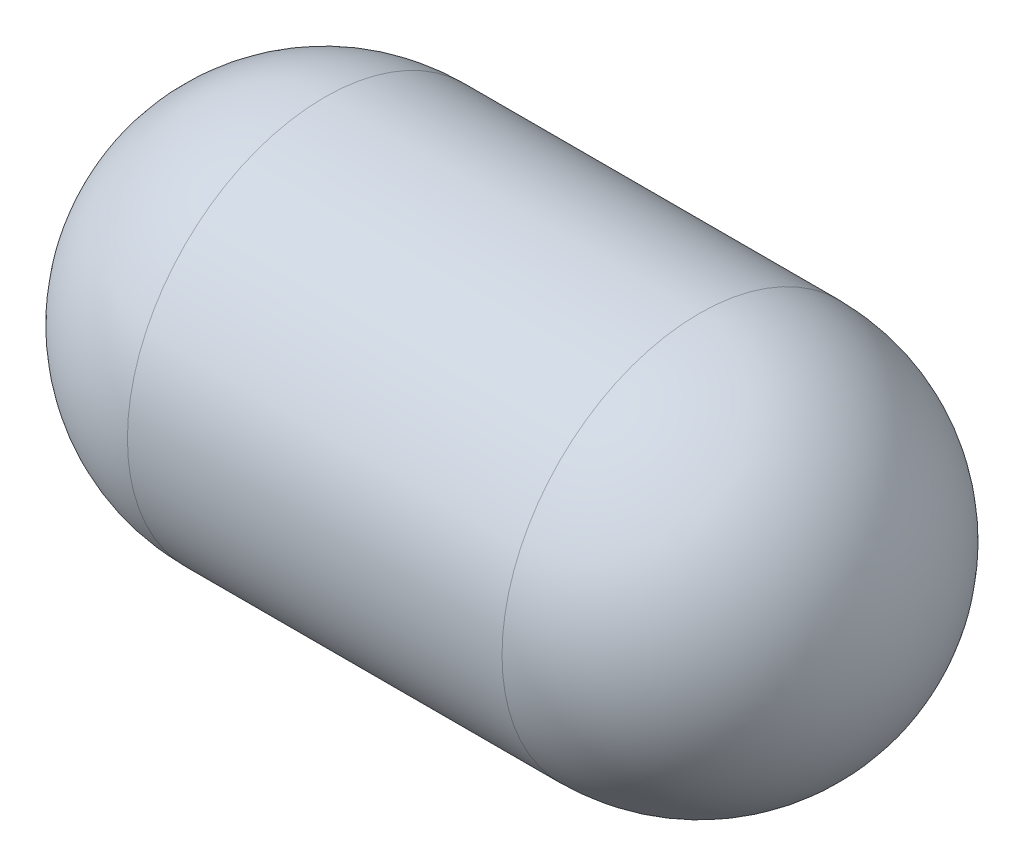
ISO-10303-21;
HEADER;
FILE_DESCRIPTION(('STEP AP214'),'2;1');
FILE_NAME('part.step','',(''),(''),'','','');
FILE_SCHEMA(('AUTOMOTIVE_DESIGN { 1 0 10303 214 1 1 1 1 }'));
ENDSEC;
DATA;
#1=APPLICATION_CONTEXT('core data for automotive mechanical design processes');
#2=APPLICATION_PROTOCOL_DEFINITION('international standard','automotive_design',2000,#1);
#3=PRODUCT_CONTEXT('',#1,'mechanical');
#4=PRODUCT('Part','Part','',(#3));
#5=PRODUCT_RELATED_PRODUCT_CATEGORY('part','',(#4));
#6=PRODUCT_DEFINITION_FORMATION('','',#4);
#7=PRODUCT_DEFINITION_CONTEXT('part definition',#1,'design');
#8=PRODUCT_DEFINITION('design','',#6,#7);
#9=PRODUCT_DEFINITION_SHAPE('','',#8);
#10=(LENGTH_UNIT() NAMED_UNIT(*) SI_UNIT(.MILLI.,.METRE.));
#11=(NAMED_UNIT(*) PLANE_ANGLE_UNIT() SI_UNIT($,.RADIAN.));
#12=(NAMED_UNIT(*) SI_UNIT($,.STERADIAN.) SOLID_ANGLE_UNIT());
#13=UNCERTAINTY_MEASURE_WITH_UNIT(LENGTH_MEASURE(1.E-05),#10,'distance_accuracy_value','');
#14=(GEOMETRIC_REPRESENTATION_CONTEXT(3) GLOBAL_UNCERTAINTY_ASSIGNED_CONTEXT((#13)) GLOBAL_UNIT_ASSIGNED_CONTEXT((#10,
#11,#12)) REPRESENTATION_CONTEXT('',''));
#15=CARTESIAN_POINT('',(0.,0.,0.));
#16=DIRECTION('',(0.,0.,1.));
#17=DIRECTION('',(1.,0.,0.));
#18=AXIS2_PLACEMENT_3D('',#15,#16,#17);
#19=CARTESIAN_POINT('',(0.,0.,0.));
#20=DIRECTION('',(-1.,0.,0.));
#21=DIRECTION('',(0.,0.,-1.));
#22=AXIS2_PLACEMENT_3D('',#19,#20,#21);
#23=SPHERICAL_SURFACE('',#22,200.);
#24=CARTESIAN_POINT('',(0.,0.,0.));
#25=DIRECTION('',(-1.,0.,0.));
#26=DIRECTION('',(0.,0.,1.));
#27=AXIS2_PLACEMENT_3D('',#24,#25,#26);
#28=CIRCLE('',#27,200.);
#29=CARTESIAN_POINT('',(0.,0.,200.));
#30=VERTEX_POINT('',#29);
#31=EDGE_CURVE('E63',#30,#30,#28,.T.);
#32=ORIENTED_EDGE('',*,*,#31,.T.);
#33=EDGE_LOOP('',(#32));
#34=FACE_BOUND('',#33,.T.);
#35=ADVANCED_FACE('F44',(#34),#23,.T.);
#36=CARTESIAN_POINT('',(380.,0.,0.));
#37=DIRECTION('',(-1.,0.,0.));
#38=DIRECTION('',(0.,0.,-1.));
#39=AXIS2_PLACEMENT_3D('',#36,#37,#38);
#40=SPHERICAL_SURFACE('',#39,200.);
#41=CARTESIAN_POINT('',(380.,0.,0.));
#42=DIRECTION('',(-1.,0.,0.));
#43=DIRECTION('',(0.,0.,1.));
#44=AXIS2_PLACEMENT_3D('',#41,#42,#43);
#45=CIRCLE('',#44,200.);
#46=CARTESIAN_POINT('',(380.,0.,200.));
#47=VERTEX_POINT('',#46);
#48=EDGE_CURVE('E58',#47,#47,#45,.T.);
#49=ORIENTED_EDGE('',*,*,#48,.F.);
#50=EDGE_LOOP('',(#49));
#51=FACE_BOUND('',#50,.T.);
#52=ADVANCED_FACE('F72',(#51),#40,.T.);
#53=CARTESIAN_POINT('',(-1230.06582523577,0.,0.));
#54=DIRECTION('',(-1.,0.,0.));
#55=DIRECTION('',(0.,0.,1.));
#56=AXIS2_PLACEMENT_3D('',#53,#54,#55);
#57=CYLINDRICAL_SURFACE('',#56,200.);
#58=ORIENTED_EDGE('',*,*,#31,.F.);
#59=EDGE_LOOP('',(#58));
#60=FACE_BOUND('',#59,.T.);
#61=ORIENTED_EDGE('',*,*,#48,.T.);
#62=EDGE_LOOP('',(#61));
#63=FACE_BOUND('',#62,.T.);
#64=ADVANCED_FACE('F69',(#60,#63),#57,.T.);
#65=CLOSED_SHELL('',(#35,#52,#64));
#66=CARTESIAN_POINT('',(0.,0.,0.));
#67=DIRECTION('',(-1.,0.,0.));
#68=DIRECTION('',(0.,0.,-1.));
#69=AXIS2_PLACEMENT_3D('',#66,#67,#68);
#70=SPHERICAL_SURFACE('',#69,190.);
#71=CARTESIAN_POINT('',(0.,0.,0.));
#72=DIRECTION('',(-1.,0.,0.));
#73=DIRECTION('',(0.,0.,1.));
#74=AXIS2_PLACEMENT_3D('',#71,#72,#73);
#75=CIRCLE('',#74,190.);
#76=CARTESIAN_POINT('',(0.,0.,190.));
#77=VERTEX_POINT('',#76);
#78=EDGE_CURVE('E48',#77,#77,#75,.T.);
#79=ORIENTED_EDGE('',*,*,#78,.F.);
#80=EDGE_LOOP('',(#79));
#81=FACE_BOUND('',#80,.T.);
#82=ADVANCED_FACE('F83',(#81),#70,.F.);
#83=CARTESIAN_POINT('',(380.,0.,0.));
#84=DIRECTION('',(-1.,0.,0.));
#85=DIRECTION('',(0.,0.,-1.));
#86=AXIS2_PLACEMENT_3D('',#83,#84,#85);
#87=SPHERICAL_SURFACE('',#86,190.);
#88=CARTESIAN_POINT('',(380.,0.,0.));
#89=DIRECTION('',(-1.,0.,0.));
#90=DIRECTION('',(0.,0.,1.));
#91=AXIS2_PLACEMENT_3D('',#88,#89,#90);
#92=CIRCLE('',#91,190.);
#93=CARTESIAN_POINT('',(380.,0.,190.));
#94=VERTEX_POINT('',#93);
#95=EDGE_CURVE('E10',#94,#94,#92,.T.);
#96=ORIENTED_EDGE('',*,*,#95,.T.);
#97=EDGE_LOOP('',(#96));
#98=FACE_BOUND('',#97,.T.);
#99=ADVANCED_FACE('F85',(#98),#87,.F.);
#100=CARTESIAN_POINT('',(-1230.06582523577,0.,0.));
#101=DIRECTION('',(-1.,0.,0.));
#102=DIRECTION('',(0.,0.,1.));
#103=AXIS2_PLACEMENT_3D('',#100,#101,#102);
#104=CYLINDRICAL_SURFACE('',#103,190.);
#105=ORIENTED_EDGE('',*,*,#78,.T.);
#106=EDGE_LOOP('',(#105));
#107=FACE_BOUND('',#106,.T.);
#108=ORIENTED_EDGE('',*,*,#95,.F.);
#109=EDGE_LOOP('',(#108));
#110=FACE_BOUND('',#109,.T.);
#111=ADVANCED_FACE('F46',(#107,#110),#104,.F.);
#112=CLOSED_SHELL('',(#82,#99,#111));
#113=ORIENTED_CLOSED_SHELL('',*,#112,.T.);
#114=BREP_WITH_VOIDS('B2',#65,(#113));
#115=ADVANCED_BREP_SHAPE_REPRESENTATION('',(#18,#114),#14);
#116=SHAPE_DEFINITION_REPRESENTATION(#9,#115);
ENDSEC;
END-ISO-10303-21;
